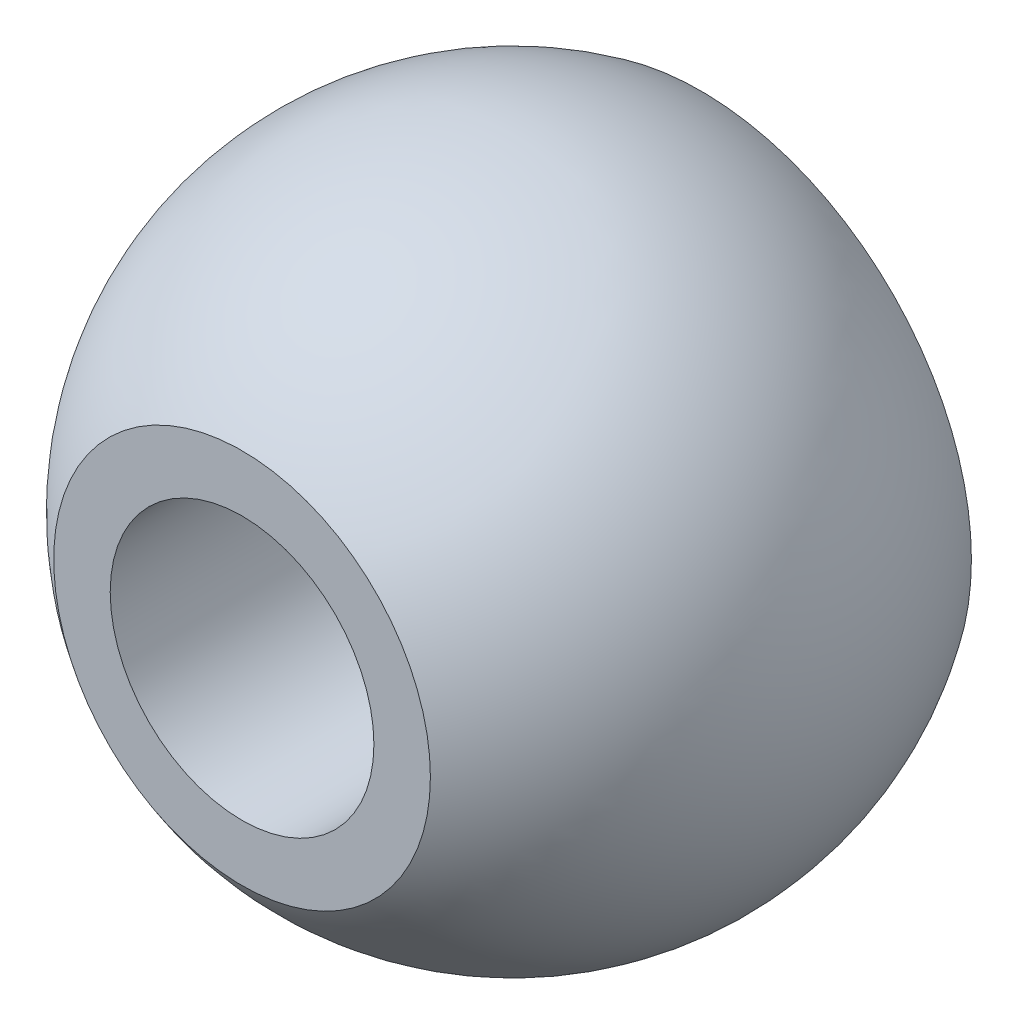
ISO-10303-21;
HEADER;
FILE_DESCRIPTION(('STEP AP214'),'2;1');
FILE_NAME('part.step','',(''),(''),'','','');
FILE_SCHEMA(('AUTOMOTIVE_DESIGN { 1 0 10303 214 1 1 1 1 }'));
ENDSEC;
DATA;
#1=APPLICATION_CONTEXT('core data for automotive mechanical design processes');
#2=APPLICATION_PROTOCOL_DEFINITION('international standard','automotive_design',2000,#1);
#3=PRODUCT_CONTEXT('',#1,'mechanical');
#4=PRODUCT('Part','Part','',(#3));
#5=PRODUCT_RELATED_PRODUCT_CATEGORY('part','',(#4));
#6=PRODUCT_DEFINITION_FORMATION('','',#4);
#7=PRODUCT_DEFINITION_CONTEXT('part definition',#1,'design');
#8=PRODUCT_DEFINITION('design','',#6,#7);
#9=PRODUCT_DEFINITION_SHAPE('','',#8);
#10=(LENGTH_UNIT() NAMED_UNIT(*) SI_UNIT(.MILLI.,.METRE.));
#11=(NAMED_UNIT(*) PLANE_ANGLE_UNIT() SI_UNIT($,.RADIAN.));
#12=(NAMED_UNIT(*) SI_UNIT($,.STERADIAN.) SOLID_ANGLE_UNIT());
#13=UNCERTAINTY_MEASURE_WITH_UNIT(LENGTH_MEASURE(1.E-05),#10,'distance_accuracy_value','');
#14=(GEOMETRIC_REPRESENTATION_CONTEXT(3) GLOBAL_UNCERTAINTY_ASSIGNED_CONTEXT((#13)) GLOBAL_UNIT_ASSIGNED_CONTEXT((#10,
#11,#12)) REPRESENTATION_CONTEXT('',''));
#15=CARTESIAN_POINT('',(0.,0.,0.));
#16=DIRECTION('',(0.,0.,1.));
#17=DIRECTION('',(1.,0.,0.));
#18=AXIS2_PLACEMENT_3D('',#15,#16,#17);
#19=CARTESIAN_POINT('',(8.,0.,3.));
#20=DIRECTION('',(0.,0.,1.));
#21=DIRECTION('',(1.,0.,0.));
#22=AXIS2_PLACEMENT_3D('',#19,#20,#21);
#23=SPHERICAL_SURFACE('',#22,5.25);
#24=CARTESIAN_POINT('',(8.,0.,0.));
#25=DIRECTION('',(0.,0.,1.));
#26=DIRECTION('',(1.,0.,0.));
#27=AXIS2_PLACEMENT_3D('',#24,#25,#26);
#28=CIRCLE('',#27,4.30842198490352);
#29=CARTESIAN_POINT('',(12.3084219849035,0.,0.));
#30=VERTEX_POINT('',#29);
#31=EDGE_CURVE('E10',#30,#30,#28,.T.);
#32=CARTESIAN_POINT('',(8.,0.,7.30842198490352));
#33=DIRECTION('',(0.,0.,1.));
#34=DIRECTION('',(1.,0.,0.));
#35=AXIS2_PLACEMENT_3D('',#32,#33,#34);
#36=CIRCLE('',#35,3.);
#37=CARTESIAN_POINT('',(11.,0.,7.30842198490352));
#38=VERTEX_POINT('',#37);
#39=EDGE_CURVE('E58',#38,#38,#36,.T.);
#40=CARTESIAN_POINT('',(12.3084219849035,0.,0.));
#41=CARTESIAN_POINT('',(12.3575109150911,0.,0.0704954198003986));
#42=CARTESIAN_POINT('',(12.4048665773805,0.,0.142197543513688));
#43=CARTESIAN_POINT('',(12.4960040724562,0.,0.287838212895943));
#44=CARTESIAN_POINT('',(12.5397859052423,0.,0.361776758564909));
#45=CARTESIAN_POINT('',(12.6236684476044,0.,0.511713285988413));
#46=CARTESIAN_POINT('',(12.6637691571803,0.,0.587711267742951));
#47=CARTESIAN_POINT('',(12.7401933345167,0.,0.741583276465971));
#48=CARTESIAN_POINT('',(12.7765168022772,0.,0.819457303434452));
#49=CARTESIAN_POINT('',(12.8452988589377,0.,0.976893878978552));
#50=CARTESIAN_POINT('',(12.8777574478377,0.,1.05645642755417));
#51=CARTESIAN_POINT('',(12.9387315861957,0.,1.21707835126063));
#52=CARTESIAN_POINT('',(12.9672471356536,0.,1.29813772639148));
#53=CARTESIAN_POINT('',(13.0202664892924,0.,1.46155802994277));
#54=CARTESIAN_POINT('',(13.0447702934732,0.,1.54391895836322));
#55=CARTESIAN_POINT('',(13.0897071272601,0.,1.70974395223059));
#56=CARTESIAN_POINT('',(13.1101401568662,0.,1.79320801767751));
#57=CARTESIAN_POINT('',(13.1468862158724,0.,1.96103821377495));
#58=CARTESIAN_POINT('',(13.1631992452724,0.,2.04540434442547));
#59=CARTESIAN_POINT('',(13.1916660045302,0.,2.21483542541887));
#60=CARTESIAN_POINT('',(13.2038197343879,0.,2.29990037576175));
#61=CARTESIAN_POINT('',(13.2239386151128,0.,2.47052416725393));
#62=CARTESIAN_POINT('',(13.2319037659801,0.,2.55608300840323));
#63=CARTESIAN_POINT('',(13.243626299991,0.,2.72748846275775));
#64=CARTESIAN_POINT('',(13.2473836831347,0.,2.81333507596297));
#65=CARTESIAN_POINT('',(13.2506816298299,0.,2.98510926242101));
#66=CARTESIAN_POINT('',(13.2502221933814,0.,3.07103683567383));
#67=CARTESIAN_POINT('',(13.2450876077158,0.,3.24276593517617));
#68=CARTESIAN_POINT('',(13.2404124584987,0.,3.32856746142568));
#69=CARTESIAN_POINT('',(13.2268577101397,0.,3.49983776352949));
#70=CARTESIAN_POINT('',(13.2179781109977,0.,3.58530653938378));
#71=CARTESIAN_POINT('',(13.196035854521,0.,3.75570543892991));
#72=CARTESIAN_POINT('',(13.1829731971863,0.,3.84063556262173));
#73=CARTESIAN_POINT('',(13.1526962934099,0.,4.00975255373595));
#74=CARTESIAN_POINT('',(13.1354820469681,0.,4.09393942115834));
#75=CARTESIAN_POINT('',(13.0969434356051,0.,4.26136708619617));
#76=CARTESIAN_POINT('',(13.0756190706837,0.,4.34460788381162));
#77=CARTESIAN_POINT('',(13.0289115946243,0.,4.50994287486301));
#78=CARTESIAN_POINT('',(13.0035284834862,0.,4.59203706829897));
#79=CARTESIAN_POINT('',(12.9487646651315,0.,4.75488107888902));
#80=CARTESIAN_POINT('',(12.9193839579149,0.,4.83563089604313));
#81=CARTESIAN_POINT('',(12.8566957280996,0.,4.99559162068624));
#82=CARTESIAN_POINT('',(12.8233882055009,0.,5.07480252817525));
#83=CARTESIAN_POINT('',(12.7529265856633,0.,5.23149460747723));
#84=CARTESIAN_POINT('',(12.7157724884244,0.,5.3089757792902));
#85=CARTESIAN_POINT('',(12.6377072267715,0.,5.46202172829854));
#86=CARTESIAN_POINT('',(12.5967960623576,0.,5.53758650549391));
#87=CARTESIAN_POINT('',(12.5113152249681,0.,5.68661762314526));
#88=CARTESIAN_POINT('',(12.4667455519924,0.,5.76008396360124));
#89=CARTESIAN_POINT('',(12.3740550695955,0.,5.90474122075625));
#90=CARTESIAN_POINT('',(12.3259342601741,0.,5.97593213745528));
#91=CARTESIAN_POINT('',(12.2262574326159,0.,6.11586704257132));
#92=CARTESIAN_POINT('',(12.174701414479,0.,6.18461103098831));
#93=CARTESIAN_POINT('',(12.0682783706417,0.,6.31948646690412));
#94=CARTESIAN_POINT('',(12.0134113449414,0.,6.38561791440293));
#95=CARTESIAN_POINT('',(11.9004984722079,0.,6.51510896079126));
#96=CARTESIAN_POINT('',(11.8424526251749,0.,6.57846855968079));
#97=CARTESIAN_POINT('',(11.7233219220769,0.,6.70226323734053));
#98=CARTESIAN_POINT('',(11.662237066012,0.,6.76269831611074));
#99=CARTESIAN_POINT('',(11.5371755977743,0.,6.88049848212188));
#100=CARTESIAN_POINT('',(11.4731989856017,0.,6.9378635693628));
#101=CARTESIAN_POINT('',(11.342507779018,0.,7.04938509952922));
#102=CARTESIAN_POINT('',(11.2757931846071,0.,7.10354154245472));
#103=CARTESIAN_POINT('',(11.1397880462646,0.,7.20851701545299));
#104=CARTESIAN_POINT('',(11.070497502333,0.,7.25933604552576));
#105=CARTESIAN_POINT('',(11.,0.,7.30842198490352));
#106=B_SPLINE_CURVE_WITH_KNOTS('',3,(#40,#41,#42,#43,#44,#45,#46,#47,#48,#49,#50,#51,#52,#53,
#54,#55,#56,#57,#58,#59,#60,#61,#62,#63,#64,#65,#66,#67,#68,#69,#70,#71,#72,#73,#74,#75,#76,#77,
#78,#79,#80,#81,#82,#83,#84,#85,#86,#87,#88,#89,#90,#91,#92,#93,#94,#95,#96,#97,#98,#99,#100,
#101,#102,#103,#104,#105),.UNSPECIFIED.,.F.,.F.,(4,2,2,2,2,2,2,2,2,2,2,2,2,2,2,2,2,2,2,2,2,2,2,
2,2,2,2,2,2,2,2,2,4),(0.,0.25768289949058,0.515365798981158,0.773048698471737,1.03073159796232,
1.2884144974529,1.54609739694347,1.80378029643405,2.06146319592463,2.31914609541521,
2.57682899490579,2.83451189439637,3.09219479388695,3.34987769337753,3.60756059286811,
3.86524349235868,4.12292639184926,4.38060929133984,4.63829219083042,4.895975090321,
5.15365798981158,5.41134088930216,5.66902378879274,5.92670668828332,6.1843895877739,
6.44207248726447,6.69975538675505,6.95743828624563,7.21512118573621,7.47280408522679,
7.73048698471737,7.98816988420795,8.24585278369853),.UNSPECIFIED.);
#107=EDGE_CURVE('BSEAM41',#30,#38,#106,.T.);
#108=ORIENTED_EDGE('',*,*,#31,.T.);
#109=ORIENTED_EDGE('',*,*,#39,.F.);
#110=ORIENTED_EDGE('',*,*,#107,.T.);
#111=ORIENTED_EDGE('',*,*,#107,.F.);
#112=EDGE_LOOP('',(#108,#110,#109,#111));
#113=FACE_BOUND('',#112,.T.);
#114=ADVANCED_FACE('F41',(#113),#23,.T.);
#115=CARTESIAN_POINT('',(12.3084219849035,0.,0.));
#116=DIRECTION('',(0.,0.,-1.));
#117=DIRECTION('',(-1.,0.,0.));
#118=AXIS2_PLACEMENT_3D('',#115,#116,#117);
#119=PLANE('',#118);
#120=CARTESIAN_POINT('',(8.,0.,0.));
#121=DIRECTION('',(0.,0.,1.));
#122=DIRECTION('',(1.,0.,0.));
#123=AXIS2_PLACEMENT_3D('',#120,#121,#122);
#124=CIRCLE('',#123,2.1);
#125=CARTESIAN_POINT('',(10.1,0.,0.));
#126=VERTEX_POINT('',#125);
#127=EDGE_CURVE('E48',#126,#126,#124,.T.);
#128=ORIENTED_EDGE('',*,*,#127,.T.);
#129=EDGE_LOOP('',(#128));
#130=FACE_BOUND('',#129,.T.);
#131=ORIENTED_EDGE('',*,*,#31,.F.);
#132=EDGE_LOOP('',(#131));
#133=FACE_BOUND('',#132,.T.);
#134=ADVANCED_FACE('F69',(#130,#133),#119,.T.);
#135=CARTESIAN_POINT('',(8.,0.,0.));
#136=DIRECTION('',(0.,0.,1.));
#137=DIRECTION('',(1.,0.,0.));
#138=AXIS2_PLACEMENT_3D('',#135,#136,#137);
#139=CYLINDRICAL_SURFACE('',#138,2.1);
#140=CARTESIAN_POINT('',(8.,0.,7.30842198490352));
#141=DIRECTION('',(0.,0.,1.));
#142=DIRECTION('',(1.,0.,0.));
#143=AXIS2_PLACEMENT_3D('',#140,#141,#142);
#144=CIRCLE('',#143,2.1);
#145=CARTESIAN_POINT('',(10.1,0.,7.30842198490352));
#146=VERTEX_POINT('',#145);
#147=EDGE_CURVE('E53',#146,#146,#144,.T.);
#148=ORIENTED_EDGE('',*,*,#147,.T.);
#149=EDGE_LOOP('',(#148));
#150=FACE_BOUND('',#149,.T.);
#151=ORIENTED_EDGE('',*,*,#127,.F.);
#152=EDGE_LOOP('',(#151));
#153=FACE_BOUND('',#152,.T.);
#154=ADVANCED_FACE('F73',(#150,#153),#139,.F.);
#155=CARTESIAN_POINT('',(10.1,0.,7.30842198490352));
#156=DIRECTION('',(0.,0.,1.));
#157=DIRECTION('',(1.,0.,0.));
#158=AXIS2_PLACEMENT_3D('',#155,#156,#157);
#159=PLANE('',#158);
#160=ORIENTED_EDGE('',*,*,#39,.T.);
#161=EDGE_LOOP('',(#160));
#162=FACE_BOUND('',#161,.T.);
#163=ORIENTED_EDGE('',*,*,#147,.F.);
#164=EDGE_LOOP('',(#163));
#165=FACE_BOUND('',#164,.T.);
#166=ADVANCED_FACE('F65',(#162,#165),#159,.T.);
#167=CLOSED_SHELL('',(#114,#134,#154,#166));
#168=MANIFOLD_SOLID_BREP('B2',#167);
#169=ADVANCED_BREP_SHAPE_REPRESENTATION('',(#18,#168),#14);
#170=SHAPE_DEFINITION_REPRESENTATION(#9,#169);
ENDSEC;
END-ISO-10303-21;
